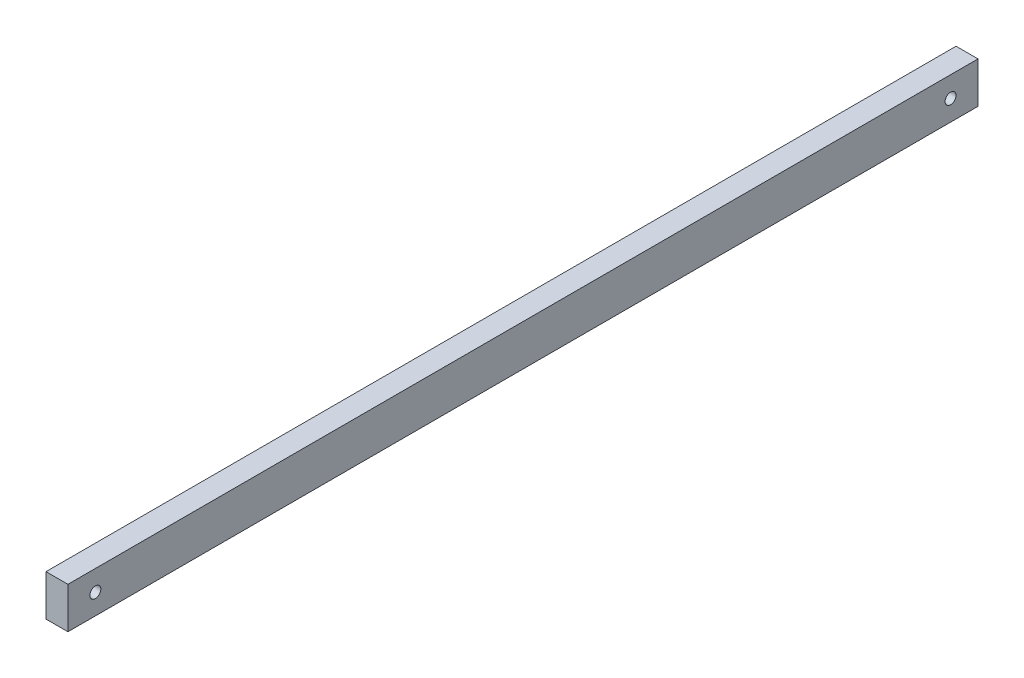
ISO-10303-21;
HEADER;
FILE_DESCRIPTION(('STEP AP214'),'2;1');
FILE_NAME('part.step','',(''),(''),'','','');
FILE_SCHEMA(('AUTOMOTIVE_DESIGN { 1 0 10303 214 1 1 1 1 }'));
ENDSEC;
DATA;
#1=APPLICATION_CONTEXT('core data for automotive mechanical design processes');
#2=APPLICATION_PROTOCOL_DEFINITION('international standard','automotive_design',2000,#1);
#3=PRODUCT_CONTEXT('',#1,'mechanical');
#4=PRODUCT('Part','Part','',(#3));
#5=PRODUCT_RELATED_PRODUCT_CATEGORY('part','',(#4));
#6=PRODUCT_DEFINITION_FORMATION('','',#4);
#7=PRODUCT_DEFINITION_CONTEXT('part definition',#1,'design');
#8=PRODUCT_DEFINITION('design','',#6,#7);
#9=PRODUCT_DEFINITION_SHAPE('','',#8);
#10=(LENGTH_UNIT() NAMED_UNIT(*) SI_UNIT(.MILLI.,.METRE.));
#11=(NAMED_UNIT(*) PLANE_ANGLE_UNIT() SI_UNIT($,.RADIAN.));
#12=(NAMED_UNIT(*) SI_UNIT($,.STERADIAN.) SOLID_ANGLE_UNIT());
#13=UNCERTAINTY_MEASURE_WITH_UNIT(LENGTH_MEASURE(1.E-05),#10,'distance_accuracy_value','');
#14=(GEOMETRIC_REPRESENTATION_CONTEXT(3) GLOBAL_UNCERTAINTY_ASSIGNED_CONTEXT((#13)) GLOBAL_UNIT_ASSIGNED_CONTEXT((#10,
#11,#12)) REPRESENTATION_CONTEXT('',''));
#15=CARTESIAN_POINT('',(0.,0.,0.));
#16=DIRECTION('',(0.,0.,1.));
#17=DIRECTION('',(1.,0.,0.));
#18=AXIS2_PLACEMENT_3D('',#15,#16,#17);
#19=CARTESIAN_POINT('',(4.,-7.5,332.));
#20=DIRECTION('',(-1.,0.,0.));
#21=DIRECTION('',(0.,0.,1.));
#22=AXIS2_PLACEMENT_3D('',#19,#20,#21);
#23=PLANE('',#22);
#24=CARTESIAN_POINT('',(4.,0.,10.));
#25=DIRECTION('',(-1.,0.,0.));
#26=DIRECTION('',(0.,0.,1.));
#27=AXIS2_PLACEMENT_3D('',#24,#25,#26);
#28=CIRCLE('',#27,2.);
#29=CARTESIAN_POINT('',(4.,0.,12.));
#30=VERTEX_POINT('',#29);
#31=EDGE_CURVE('E99',#30,#30,#28,.F.);
#32=ORIENTED_EDGE('',*,*,#31,.F.);
#33=EDGE_LOOP('',(#32));
#34=FACE_BOUND('',#33,.T.);
#35=CARTESIAN_POINT('',(4.,0.,322.));
#36=DIRECTION('',(-1.,0.,0.));
#37=DIRECTION('',(0.,0.,1.));
#38=AXIS2_PLACEMENT_3D('',#35,#36,#37);
#39=CIRCLE('',#38,2.);
#40=CARTESIAN_POINT('',(4.,0.,324.));
#41=VERTEX_POINT('',#40);
#42=EDGE_CURVE('E110',#41,#41,#39,.F.);
#43=ORIENTED_EDGE('',*,*,#42,.F.);
#44=EDGE_LOOP('',(#43));
#45=FACE_BOUND('',#44,.T.);
#46=DIRECTION('',(0.,1.,0.));
#47=VECTOR('',#46,1.);
#48=CARTESIAN_POINT('',(4.,-7.5,0.));
#49=LINE('',#48,#47);
#50=CARTESIAN_POINT('',(4.,-7.5,0.));
#51=VERTEX_POINT('',#50);
#52=CARTESIAN_POINT('',(4.,7.5,0.));
#53=VERTEX_POINT('',#52);
#54=EDGE_CURVE('E96',#51,#53,#49,.T.);
#55=ORIENTED_EDGE('',*,*,#54,.T.);
#56=DIRECTION('',(0.,0.,-1.));
#57=VECTOR('',#56,1.);
#58=CARTESIAN_POINT('',(4.,7.5,332.));
#59=LINE('',#58,#57);
#60=CARTESIAN_POINT('',(4.,7.5,332.));
#61=VERTEX_POINT('',#60);
#62=EDGE_CURVE('E11',#61,#53,#59,.T.);
#63=ORIENTED_EDGE('',*,*,#62,.F.);
#64=DIRECTION('',(0.,1.,0.));
#65=VECTOR('',#64,1.);
#66=CARTESIAN_POINT('',(4.,-7.5,332.));
#67=LINE('',#66,#65);
#68=CARTESIAN_POINT('',(4.,-7.5,332.));
#69=VERTEX_POINT('',#68);
#70=EDGE_CURVE('E84',#69,#61,#67,.T.);
#71=ORIENTED_EDGE('',*,*,#70,.F.);
#72=DIRECTION('',(0.,0.,-1.));
#73=VECTOR('',#72,1.);
#74=CARTESIAN_POINT('',(4.,-7.5,332.));
#75=LINE('',#74,#73);
#76=EDGE_CURVE('E92',#69,#51,#75,.T.);
#77=ORIENTED_EDGE('',*,*,#76,.T.);
#78=EDGE_LOOP('',(#55,#63,#71,#77));
#79=FACE_BOUND('',#78,.T.);
#80=ADVANCED_FACE('F33',(#34,#45,#79),#23,.F.);
#81=CARTESIAN_POINT('',(-4.,7.5,332.));
#82=DIRECTION('',(0.,-1.,0.));
#83=DIRECTION('',(0.,0.,-1.));
#84=AXIS2_PLACEMENT_3D('',#81,#82,#83);
#85=PLANE('',#84);
#86=DIRECTION('',(-1.,0.,0.));
#87=VECTOR('',#86,1.);
#88=CARTESIAN_POINT('',(-4.,7.5,0.));
#89=LINE('',#88,#87);
#90=CARTESIAN_POINT('',(-4.,7.5,0.));
#91=VERTEX_POINT('',#90);
#92=EDGE_CURVE('E88',#53,#91,#89,.T.);
#93=ORIENTED_EDGE('',*,*,#92,.T.);
#94=DIRECTION('',(0.,0.,-1.));
#95=VECTOR('',#94,1.);
#96=CARTESIAN_POINT('',(-4.,7.5,332.));
#97=LINE('',#96,#95);
#98=CARTESIAN_POINT('',(-4.,7.5,332.));
#99=VERTEX_POINT('',#98);
#100=EDGE_CURVE('E41',#99,#91,#97,.T.);
#101=ORIENTED_EDGE('',*,*,#100,.F.);
#102=DIRECTION('',(-1.,0.,0.));
#103=VECTOR('',#102,1.);
#104=CARTESIAN_POINT('',(-4.,7.5,332.));
#105=LINE('',#104,#103);
#106=EDGE_CURVE('E79',#61,#99,#105,.T.);
#107=ORIENTED_EDGE('',*,*,#106,.F.);
#108=ORIENTED_EDGE('',*,*,#62,.T.);
#109=EDGE_LOOP('',(#93,#101,#107,#108));
#110=FACE_BOUND('',#109,.T.);
#111=ADVANCED_FACE('F87',(#110),#85,.F.);
#112=CARTESIAN_POINT('',(-4.,-7.5,332.));
#113=DIRECTION('',(1.,0.,0.));
#114=DIRECTION('',(0.,0.,-1.));
#115=AXIS2_PLACEMENT_3D('',#112,#113,#114);
#116=PLANE('',#115);
#117=CARTESIAN_POINT('',(-4.,0.,10.));
#118=DIRECTION('',(-1.,0.,0.));
#119=DIRECTION('',(0.,0.,1.));
#120=AXIS2_PLACEMENT_3D('',#117,#118,#119);
#121=CIRCLE('',#120,2.);
#122=CARTESIAN_POINT('',(-4.,0.,12.));
#123=VERTEX_POINT('',#122);
#124=EDGE_CURVE('E113',#123,#123,#121,.T.);
#125=ORIENTED_EDGE('',*,*,#124,.F.);
#126=EDGE_LOOP('',(#125));
#127=FACE_BOUND('',#126,.T.);
#128=CARTESIAN_POINT('',(-4.,0.,322.));
#129=DIRECTION('',(-1.,0.,0.));
#130=DIRECTION('',(0.,0.,1.));
#131=AXIS2_PLACEMENT_3D('',#128,#129,#130);
#132=CIRCLE('',#131,2.);
#133=CARTESIAN_POINT('',(-4.,0.,324.));
#134=VERTEX_POINT('',#133);
#135=EDGE_CURVE('E114',#134,#134,#132,.T.);
#136=ORIENTED_EDGE('',*,*,#135,.F.);
#137=EDGE_LOOP('',(#136));
#138=FACE_BOUND('',#137,.T.);
#139=DIRECTION('',(0.,-1.,0.));
#140=VECTOR('',#139,1.);
#141=CARTESIAN_POINT('',(-4.,-7.5,0.));
#142=LINE('',#141,#140);
#143=CARTESIAN_POINT('',(-4.,-7.5,0.));
#144=VERTEX_POINT('',#143);
#145=EDGE_CURVE('E66',#91,#144,#142,.T.);
#146=ORIENTED_EDGE('',*,*,#145,.T.);
#147=DIRECTION('',(0.,0.,-1.));
#148=VECTOR('',#147,1.);
#149=CARTESIAN_POINT('',(-4.,-7.5,332.));
#150=LINE('',#149,#148);
#151=CARTESIAN_POINT('',(-4.,-7.5,332.));
#152=VERTEX_POINT('',#151);
#153=EDGE_CURVE('E89',#152,#144,#150,.T.);
#154=ORIENTED_EDGE('',*,*,#153,.F.);
#155=DIRECTION('',(0.,-1.,0.));
#156=VECTOR('',#155,1.);
#157=CARTESIAN_POINT('',(-4.,-7.5,332.));
#158=LINE('',#157,#156);
#159=EDGE_CURVE('E82',#99,#152,#158,.T.);
#160=ORIENTED_EDGE('',*,*,#159,.F.);
#161=ORIENTED_EDGE('',*,*,#100,.T.);
#162=EDGE_LOOP('',(#146,#154,#160,#161));
#163=FACE_BOUND('',#162,.T.);
#164=ADVANCED_FACE('F90',(#127,#138,#163),#116,.F.);
#165=CARTESIAN_POINT('',(-4.,-7.5,332.));
#166=DIRECTION('',(0.,1.,0.));
#167=DIRECTION('',(0.,0.,1.));
#168=AXIS2_PLACEMENT_3D('',#165,#166,#167);
#169=PLANE('',#168);
#170=DIRECTION('',(1.,0.,0.));
#171=VECTOR('',#170,1.);
#172=CARTESIAN_POINT('',(-4.,-7.5,0.));
#173=LINE('',#172,#171);
#174=EDGE_CURVE('E72',#144,#51,#173,.T.);
#175=ORIENTED_EDGE('',*,*,#174,.T.);
#176=ORIENTED_EDGE('',*,*,#76,.F.);
#177=DIRECTION('',(1.,0.,0.));
#178=VECTOR('',#177,1.);
#179=CARTESIAN_POINT('',(-4.,-7.5,332.));
#180=LINE('',#179,#178);
#181=EDGE_CURVE('E49',#152,#69,#180,.T.);
#182=ORIENTED_EDGE('',*,*,#181,.F.);
#183=ORIENTED_EDGE('',*,*,#153,.T.);
#184=EDGE_LOOP('',(#175,#176,#182,#183));
#185=FACE_BOUND('',#184,.T.);
#186=ADVANCED_FACE('F104',(#185),#169,.F.);
#187=CARTESIAN_POINT('',(0.,0.,332.));
#188=DIRECTION('',(0.,0.,-1.));
#189=DIRECTION('',(-1.,0.,0.));
#190=AXIS2_PLACEMENT_3D('',#187,#188,#189);
#191=PLANE('',#190);
#192=ORIENTED_EDGE('',*,*,#70,.T.);
#193=ORIENTED_EDGE('',*,*,#106,.T.);
#194=ORIENTED_EDGE('',*,*,#159,.T.);
#195=ORIENTED_EDGE('',*,*,#181,.T.);
#196=EDGE_LOOP('',(#192,#193,#194,#195));
#197=FACE_BOUND('',#196,.T.);
#198=ADVANCED_FACE('F80',(#197),#191,.F.);
#199=CARTESIAN_POINT('',(0.,0.,0.));
#200=DIRECTION('',(0.,0.,-1.));
#201=DIRECTION('',(-1.,0.,0.));
#202=AXIS2_PLACEMENT_3D('',#199,#200,#201);
#203=PLANE('',#202);
#204=ORIENTED_EDGE('',*,*,#54,.F.);
#205=ORIENTED_EDGE('',*,*,#174,.F.);
#206=ORIENTED_EDGE('',*,*,#145,.F.);
#207=ORIENTED_EDGE('',*,*,#92,.F.);
#208=EDGE_LOOP('',(#204,#205,#206,#207));
#209=FACE_BOUND('',#208,.T.);
#210=ADVANCED_FACE('F107',(#209),#203,.T.);
#211=CARTESIAN_POINT('',(4.001,0.,322.));
#212=DIRECTION('',(-1.,0.,0.));
#213=DIRECTION('',(0.,0.,1.));
#214=AXIS2_PLACEMENT_3D('',#211,#212,#213);
#215=CYLINDRICAL_SURFACE('',#214,2.);
#216=ORIENTED_EDGE('',*,*,#135,.T.);
#217=EDGE_LOOP('',(#216));
#218=FACE_BOUND('',#217,.T.);
#219=ORIENTED_EDGE('',*,*,#42,.T.);
#220=EDGE_LOOP('',(#219));
#221=FACE_BOUND('',#220,.T.);
#222=ADVANCED_FACE('F130',(#218,#221),#215,.F.);
#223=CARTESIAN_POINT('',(4.001,0.,10.));
#224=DIRECTION('',(-1.,0.,0.));
#225=DIRECTION('',(0.,0.,1.));
#226=AXIS2_PLACEMENT_3D('',#223,#224,#225);
#227=CYLINDRICAL_SURFACE('',#226,2.);
#228=ORIENTED_EDGE('',*,*,#124,.T.);
#229=EDGE_LOOP('',(#228));
#230=FACE_BOUND('',#229,.T.);
#231=ORIENTED_EDGE('',*,*,#31,.T.);
#232=EDGE_LOOP('',(#231));
#233=FACE_BOUND('',#232,.T.);
#234=ADVANCED_FACE('F122',(#230,#233),#227,.F.);
#235=CLOSED_SHELL('',(#80,#111,#164,#186,#198,#210,#222,#234));
#236=MANIFOLD_SOLID_BREP('B2',#235);
#237=ADVANCED_BREP_SHAPE_REPRESENTATION('',(#18,#236),#14);
#238=SHAPE_DEFINITION_REPRESENTATION(#9,#237);
ENDSEC;
END-ISO-10303-21;
